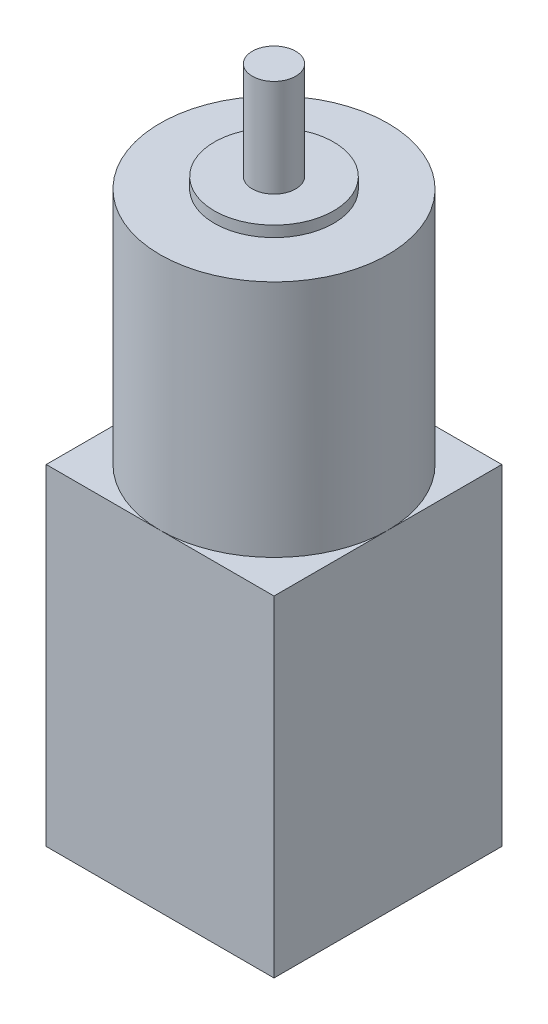
ISO-10303-21;
HEADER;
FILE_DESCRIPTION(('STEP AP214'),'2;1');
FILE_NAME('part.step','',(''),(''),'','','');
FILE_SCHEMA(('AUTOMOTIVE_DESIGN { 1 0 10303 214 1 1 1 1 }'));
ENDSEC;
DATA;
#1=APPLICATION_CONTEXT('core data for automotive mechanical design processes');
#2=APPLICATION_PROTOCOL_DEFINITION('international standard','automotive_design',2000,#1);
#3=PRODUCT_CONTEXT('',#1,'mechanical');
#4=PRODUCT('Part','Part','',(#3));
#5=PRODUCT_RELATED_PRODUCT_CATEGORY('part','',(#4));
#6=PRODUCT_DEFINITION_FORMATION('','',#4);
#7=PRODUCT_DEFINITION_CONTEXT('part definition',#1,'design');
#8=PRODUCT_DEFINITION('design','',#6,#7);
#9=PRODUCT_DEFINITION_SHAPE('','',#8);
#10=(LENGTH_UNIT() NAMED_UNIT(*) SI_UNIT(.MILLI.,.METRE.));
#11=(NAMED_UNIT(*) PLANE_ANGLE_UNIT() SI_UNIT($,.RADIAN.));
#12=(NAMED_UNIT(*) SI_UNIT($,.STERADIAN.) SOLID_ANGLE_UNIT());
#13=UNCERTAINTY_MEASURE_WITH_UNIT(LENGTH_MEASURE(1.E-05),#10,'distance_accuracy_value','');
#14=(GEOMETRIC_REPRESENTATION_CONTEXT(3) GLOBAL_UNCERTAINTY_ASSIGNED_CONTEXT((#13)) GLOBAL_UNIT_ASSIGNED_CONTEXT((#10,
#11,#12)) REPRESENTATION_CONTEXT('',''));
#15=CARTESIAN_POINT('',(0.,0.,0.));
#16=DIRECTION('',(0.,0.,1.));
#17=DIRECTION('',(1.,0.,0.));
#18=AXIS2_PLACEMENT_3D('',#15,#16,#17);
#19=CARTESIAN_POINT('',(0.,61.,0.));
#20=DIRECTION('',(0.,-1.,0.));
#21=DIRECTION('',(0.,0.,-1.));
#22=AXIS2_PLACEMENT_3D('',#19,#20,#21);
#23=PLANE('',#22);
#24=CARTESIAN_POINT('',(21.,61.,-21.));
#25=DIRECTION('',(0.,1.,0.));
#26=DIRECTION('',(0.,0.,1.));
#27=AXIS2_PLACEMENT_3D('',#24,#25,#26);
#28=CIRCLE('',#27,21.);
#29=CARTESIAN_POINT('',(21.,61.,0.));
#30=VERTEX_POINT('',#29);
#31=CARTESIAN_POINT('',(42.,61.,-21.));
#32=VERTEX_POINT('',#31);
#33=EDGE_CURVE('E118',#30,#32,#28,.T.);
#34=ORIENTED_EDGE('',*,*,#33,.F.);
#35=DIRECTION('',(1.,0.,0.));
#36=VECTOR('',#35,1.);
#37=CARTESIAN_POINT('',(0.,61.,0.));
#38=LINE('',#37,#36);
#39=CARTESIAN_POINT('',(42.,61.,0.));
#40=VERTEX_POINT('',#39);
#41=EDGE_CURVE('E106',#30,#40,#38,.T.);
#42=ORIENTED_EDGE('',*,*,#41,.T.);
#43=DIRECTION('',(0.,0.,-1.));
#44=VECTOR('',#43,1.);
#45=CARTESIAN_POINT('',(42.,61.,0.));
#46=LINE('',#45,#44);
#47=EDGE_CURVE('E119',#40,#32,#46,.T.);
#48=ORIENTED_EDGE('',*,*,#47,.T.);
#49=EDGE_LOOP('',(#34,#42,#48));
#50=FACE_BOUND('',#49,.T.);
#51=ADVANCED_FACE('F39',(#50),#23,.F.);
#52=CARTESIAN_POINT('',(21.,61.,-42.));
#53=VERTEX_POINT('',#52);
#54=EDGE_CURVE('E64',#32,#53,#28,.T.);
#55=ORIENTED_EDGE('',*,*,#54,.F.);
#56=CARTESIAN_POINT('',(42.,61.,-42.));
#57=VERTEX_POINT('',#56);
#58=EDGE_CURVE('E105',#32,#57,#46,.T.);
#59=ORIENTED_EDGE('',*,*,#58,.T.);
#60=DIRECTION('',(-1.,0.,0.));
#61=VECTOR('',#60,1.);
#62=CARTESIAN_POINT('',(0.,61.,-42.));
#63=LINE('',#62,#61);
#64=EDGE_CURVE('E131',#57,#53,#63,.T.);
#65=ORIENTED_EDGE('',*,*,#64,.T.);
#66=EDGE_LOOP('',(#55,#59,#65));
#67=FACE_BOUND('',#66,.T.);
#68=ADVANCED_FACE('F162',(#67),#23,.F.);
#69=CARTESIAN_POINT('',(0.,61.,-21.));
#70=VERTEX_POINT('',#69);
#71=EDGE_CURVE('E56',#53,#70,#28,.T.);
#72=ORIENTED_EDGE('',*,*,#71,.F.);
#73=CARTESIAN_POINT('',(0.,61.,-42.));
#74=VERTEX_POINT('',#73);
#75=EDGE_CURVE('E130',#53,#74,#63,.T.);
#76=ORIENTED_EDGE('',*,*,#75,.T.);
#77=DIRECTION('',(0.,0.,1.));
#78=VECTOR('',#77,1.);
#79=CARTESIAN_POINT('',(0.,61.,0.));
#80=LINE('',#79,#78);
#81=EDGE_CURVE('E116',#74,#70,#80,.T.);
#82=ORIENTED_EDGE('',*,*,#81,.T.);
#83=EDGE_LOOP('',(#72,#76,#82));
#84=FACE_BOUND('',#83,.T.);
#85=ADVANCED_FACE('F161',(#84),#23,.F.);
#86=CARTESIAN_POINT('',(0.,61.,0.));
#87=DIRECTION('',(1.,0.,0.));
#88=DIRECTION('',(0.,0.,-1.));
#89=AXIS2_PLACEMENT_3D('',#86,#87,#88);
#90=PLANE('',#89);
#91=DIRECTION('',(0.,0.,1.));
#92=VECTOR('',#91,1.);
#93=CARTESIAN_POINT('',(0.,0.,0.));
#94=LINE('',#93,#92);
#95=CARTESIAN_POINT('',(0.,0.,-42.));
#96=VERTEX_POINT('',#95);
#97=CARTESIAN_POINT('',(0.,0.,0.));
#98=VERTEX_POINT('',#97);
#99=EDGE_CURVE('E134',#96,#98,#94,.T.);
#100=ORIENTED_EDGE('',*,*,#99,.T.);
#101=DIRECTION('',(0.,-1.,0.));
#102=VECTOR('',#101,1.);
#103=CARTESIAN_POINT('',(0.,61.,0.));
#104=LINE('',#103,#102);
#105=CARTESIAN_POINT('',(0.,61.,0.));
#106=VERTEX_POINT('',#105);
#107=EDGE_CURVE('E43',#106,#98,#104,.T.);
#108=ORIENTED_EDGE('',*,*,#107,.F.);
#109=EDGE_CURVE('E101',#70,#106,#80,.T.);
#110=ORIENTED_EDGE('',*,*,#109,.F.);
#111=ORIENTED_EDGE('',*,*,#81,.F.);
#112=DIRECTION('',(0.,-1.,0.));
#113=VECTOR('',#112,1.);
#114=CARTESIAN_POINT('',(0.,61.,-42.));
#115=LINE('',#114,#113);
#116=EDGE_CURVE('E133',#74,#96,#115,.T.);
#117=ORIENTED_EDGE('',*,*,#116,.T.);
#118=EDGE_LOOP('',(#100,#108,#110,#111,#117));
#119=FACE_BOUND('',#118,.T.);
#120=ADVANCED_FACE('F41',(#119),#90,.F.);
#121=CARTESIAN_POINT('',(0.,61.,0.));
#122=DIRECTION('',(0.,0.,-1.));
#123=DIRECTION('',(-1.,0.,0.));
#124=AXIS2_PLACEMENT_3D('',#121,#122,#123);
#125=PLANE('',#124);
#126=DIRECTION('',(1.,0.,0.));
#127=VECTOR('',#126,1.);
#128=CARTESIAN_POINT('',(0.,0.,0.));
#129=LINE('',#128,#127);
#130=CARTESIAN_POINT('',(42.,0.,0.));
#131=VERTEX_POINT('',#130);
#132=EDGE_CURVE('E137',#98,#131,#129,.T.);
#133=ORIENTED_EDGE('',*,*,#132,.T.);
#134=DIRECTION('',(0.,-1.,0.));
#135=VECTOR('',#134,1.);
#136=CARTESIAN_POINT('',(42.,61.,0.));
#137=LINE('',#136,#135);
#138=EDGE_CURVE('E112',#40,#131,#137,.T.);
#139=ORIENTED_EDGE('',*,*,#138,.F.);
#140=ORIENTED_EDGE('',*,*,#41,.F.);
#141=EDGE_CURVE('E95',#106,#30,#38,.T.);
#142=ORIENTED_EDGE('',*,*,#141,.F.);
#143=ORIENTED_EDGE('',*,*,#107,.T.);
#144=EDGE_LOOP('',(#133,#139,#140,#142,#143));
#145=FACE_BOUND('',#144,.T.);
#146=ADVANCED_FACE('F110',(#145),#125,.F.);
#147=CARTESIAN_POINT('',(42.,61.,0.));
#148=DIRECTION('',(-1.,0.,0.));
#149=DIRECTION('',(0.,0.,1.));
#150=AXIS2_PLACEMENT_3D('',#147,#148,#149);
#151=PLANE('',#150);
#152=DIRECTION('',(0.,0.,-1.));
#153=VECTOR('',#152,1.);
#154=CARTESIAN_POINT('',(42.,0.,0.));
#155=LINE('',#154,#153);
#156=CARTESIAN_POINT('',(42.,0.,-42.));
#157=VERTEX_POINT('',#156);
#158=EDGE_CURVE('E139',#131,#157,#155,.T.);
#159=ORIENTED_EDGE('',*,*,#158,.T.);
#160=DIRECTION('',(0.,-1.,0.));
#161=VECTOR('',#160,1.);
#162=CARTESIAN_POINT('',(42.,61.,-42.));
#163=LINE('',#162,#161);
#164=EDGE_CURVE('E145',#57,#157,#163,.T.);
#165=ORIENTED_EDGE('',*,*,#164,.F.);
#166=ORIENTED_EDGE('',*,*,#58,.F.);
#167=ORIENTED_EDGE('',*,*,#47,.F.);
#168=ORIENTED_EDGE('',*,*,#138,.T.);
#169=EDGE_LOOP('',(#159,#165,#166,#167,#168));
#170=FACE_BOUND('',#169,.T.);
#171=ADVANCED_FACE('F149',(#170),#151,.F.);
#172=CARTESIAN_POINT('',(0.,61.,-42.));
#173=DIRECTION('',(0.,0.,1.));
#174=DIRECTION('',(1.,0.,0.));
#175=AXIS2_PLACEMENT_3D('',#172,#173,#174);
#176=PLANE('',#175);
#177=DIRECTION('',(-1.,0.,0.));
#178=VECTOR('',#177,1.);
#179=CARTESIAN_POINT('',(0.,0.,-42.));
#180=LINE('',#179,#178);
#181=EDGE_CURVE('E141',#157,#96,#180,.T.);
#182=ORIENTED_EDGE('',*,*,#181,.T.);
#183=ORIENTED_EDGE('',*,*,#116,.F.);
#184=ORIENTED_EDGE('',*,*,#75,.F.);
#185=ORIENTED_EDGE('',*,*,#64,.F.);
#186=ORIENTED_EDGE('',*,*,#164,.T.);
#187=EDGE_LOOP('',(#182,#183,#184,#185,#186));
#188=FACE_BOUND('',#187,.T.);
#189=ADVANCED_FACE('F157',(#188),#176,.F.);
#190=EDGE_CURVE('E99',#70,#30,#28,.T.);
#191=ORIENTED_EDGE('',*,*,#190,.F.);
#192=ORIENTED_EDGE('',*,*,#109,.T.);
#193=ORIENTED_EDGE('',*,*,#141,.T.);
#194=EDGE_LOOP('',(#191,#192,#193));
#195=FACE_BOUND('',#194,.T.);
#196=ADVANCED_FACE('F97',(#195),#23,.F.);
#197=CARTESIAN_POINT('',(0.,0.,0.));
#198=DIRECTION('',(0.,-1.,0.));
#199=DIRECTION('',(0.,0.,-1.));
#200=AXIS2_PLACEMENT_3D('',#197,#198,#199);
#201=PLANE('',#200);
#202=ORIENTED_EDGE('',*,*,#99,.F.);
#203=ORIENTED_EDGE('',*,*,#181,.F.);
#204=ORIENTED_EDGE('',*,*,#158,.F.);
#205=ORIENTED_EDGE('',*,*,#132,.F.);
#206=EDGE_LOOP('',(#202,#203,#204,#205));
#207=FACE_BOUND('',#206,.T.);
#208=ADVANCED_FACE('F154',(#207),#201,.T.);
#209=CARTESIAN_POINT('',(21.,105.,-21.));
#210=DIRECTION('',(0.,-1.,0.));
#211=DIRECTION('',(0.,0.,-1.));
#212=AXIS2_PLACEMENT_3D('',#209,#210,#211);
#213=CYLINDRICAL_SURFACE('',#212,21.);
#214=CARTESIAN_POINT('',(21.,105.,-21.));
#215=DIRECTION('',(0.,1.,0.));
#216=DIRECTION('',(0.,0.,1.));
#217=AXIS2_PLACEMENT_3D('',#214,#215,#216);
#218=CIRCLE('',#217,21.);
#219=CARTESIAN_POINT('',(21.,105.,0.));
#220=VERTEX_POINT('',#219);
#221=EDGE_CURVE('E121',#220,#220,#218,.T.);
#222=ORIENTED_EDGE('',*,*,#221,.F.);
#223=EDGE_LOOP('',(#222));
#224=FACE_BOUND('',#223,.T.);
#225=ORIENTED_EDGE('',*,*,#33,.T.);
#226=ORIENTED_EDGE('',*,*,#54,.T.);
#227=ORIENTED_EDGE('',*,*,#71,.T.);
#228=ORIENTED_EDGE('',*,*,#190,.T.);
#229=EDGE_LOOP('',(#225,#226,#227,#228));
#230=FACE_BOUND('',#229,.T.);
#231=ADVANCED_FACE('F124',(#224,#230),#213,.T.);
#232=CARTESIAN_POINT('',(21.,105.,-21.));
#233=DIRECTION('',(0.,1.,0.));
#234=DIRECTION('',(0.,0.,1.));
#235=AXIS2_PLACEMENT_3D('',#232,#233,#234);
#236=PLANE('',#235);
#237=CARTESIAN_POINT('',(21.,105.,-21.));
#238=DIRECTION('',(0.,1.,0.));
#239=DIRECTION('',(0.,0.,1.));
#240=AXIS2_PLACEMENT_3D('',#237,#238,#239);
#241=CIRCLE('',#240,11.);
#242=CARTESIAN_POINT('',(21.,105.,-10.));
#243=VERTEX_POINT('',#242);
#244=EDGE_CURVE('E48',#243,#243,#241,.T.);
#245=ORIENTED_EDGE('',*,*,#244,.F.);
#246=EDGE_LOOP('',(#245));
#247=FACE_BOUND('',#246,.T.);
#248=ORIENTED_EDGE('',*,*,#221,.T.);
#249=EDGE_LOOP('',(#248));
#250=FACE_BOUND('',#249,.T.);
#251=ADVANCED_FACE('F189',(#247,#250),#236,.T.);
#252=CARTESIAN_POINT('',(21.,107.,-21.));
#253=DIRECTION('',(0.,-1.,0.));
#254=DIRECTION('',(0.,0.,-1.));
#255=AXIS2_PLACEMENT_3D('',#252,#253,#254);
#256=CYLINDRICAL_SURFACE('',#255,11.);
#257=CARTESIAN_POINT('',(21.,107.,-21.));
#258=DIRECTION('',(0.,1.,0.));
#259=DIRECTION('',(0.,0.,1.));
#260=AXIS2_PLACEMENT_3D('',#257,#258,#259);
#261=CIRCLE('',#260,11.);
#262=CARTESIAN_POINT('',(21.,107.,-10.));
#263=VERTEX_POINT('',#262);
#264=EDGE_CURVE('E122',#263,#263,#261,.T.);
#265=ORIENTED_EDGE('',*,*,#264,.F.);
#266=EDGE_LOOP('',(#265));
#267=FACE_BOUND('',#266,.T.);
#268=ORIENTED_EDGE('',*,*,#244,.T.);
#269=EDGE_LOOP('',(#268));
#270=FACE_BOUND('',#269,.T.);
#271=ADVANCED_FACE('F184',(#267,#270),#256,.T.);
#272=CARTESIAN_POINT('',(21.,107.,-21.));
#273=DIRECTION('',(0.,1.,0.));
#274=DIRECTION('',(0.,0.,1.));
#275=AXIS2_PLACEMENT_3D('',#272,#273,#274);
#276=PLANE('',#275);
#277=CARTESIAN_POINT('',(21.,107.,-21.));
#278=DIRECTION('',(0.,1.,0.));
#279=DIRECTION('',(0.,0.,1.));
#280=AXIS2_PLACEMENT_3D('',#277,#278,#279);
#281=CIRCLE('',#280,4.);
#282=CARTESIAN_POINT('',(21.,107.,-17.));
#283=VERTEX_POINT('',#282);
#284=EDGE_CURVE('E11',#283,#283,#281,.T.);
#285=ORIENTED_EDGE('',*,*,#284,.F.);
#286=EDGE_LOOP('',(#285));
#287=FACE_BOUND('',#286,.T.);
#288=ORIENTED_EDGE('',*,*,#264,.T.);
#289=EDGE_LOOP('',(#288));
#290=FACE_BOUND('',#289,.T.);
#291=ADVANCED_FACE('F178',(#287,#290),#276,.T.);
#292=CARTESIAN_POINT('',(21.,125.,-21.));
#293=DIRECTION('',(0.,-1.,0.));
#294=DIRECTION('',(0.,0.,-1.));
#295=AXIS2_PLACEMENT_3D('',#292,#293,#294);
#296=CYLINDRICAL_SURFACE('',#295,4.);
#297=CARTESIAN_POINT('',(21.,125.,-21.));
#298=DIRECTION('',(0.,1.,0.));
#299=DIRECTION('',(0.,0.,1.));
#300=AXIS2_PLACEMENT_3D('',#297,#298,#299);
#301=CIRCLE('',#300,4.);
#302=CARTESIAN_POINT('',(21.,125.,-17.));
#303=VERTEX_POINT('',#302);
#304=EDGE_CURVE('E168',#303,#303,#301,.T.);
#305=ORIENTED_EDGE('',*,*,#304,.F.);
#306=EDGE_LOOP('',(#305));
#307=FACE_BOUND('',#306,.T.);
#308=ORIENTED_EDGE('',*,*,#284,.T.);
#309=EDGE_LOOP('',(#308));
#310=FACE_BOUND('',#309,.T.);
#311=ADVANCED_FACE('F175',(#307,#310),#296,.T.);
#312=CARTESIAN_POINT('',(21.,125.,-21.));
#313=DIRECTION('',(0.,1.,0.));
#314=DIRECTION('',(0.,0.,1.));
#315=AXIS2_PLACEMENT_3D('',#312,#313,#314);
#316=PLANE('',#315);
#317=ORIENTED_EDGE('',*,*,#304,.T.);
#318=EDGE_LOOP('',(#317));
#319=FACE_BOUND('',#318,.T.);
#320=ADVANCED_FACE('F173',(#319),#316,.T.);
#321=CLOSED_SHELL('',(#51,#68,#85,#120,#146,#171,#189,#196,#208,#231,#251,#271,#291,#311,#320));
#322=MANIFOLD_SOLID_BREP('B2',#321);
#323=ADVANCED_BREP_SHAPE_REPRESENTATION('',(#18,#322),#14);
#324=SHAPE_DEFINITION_REPRESENTATION(#9,#323);
ENDSEC;
END-ISO-10303-21;
